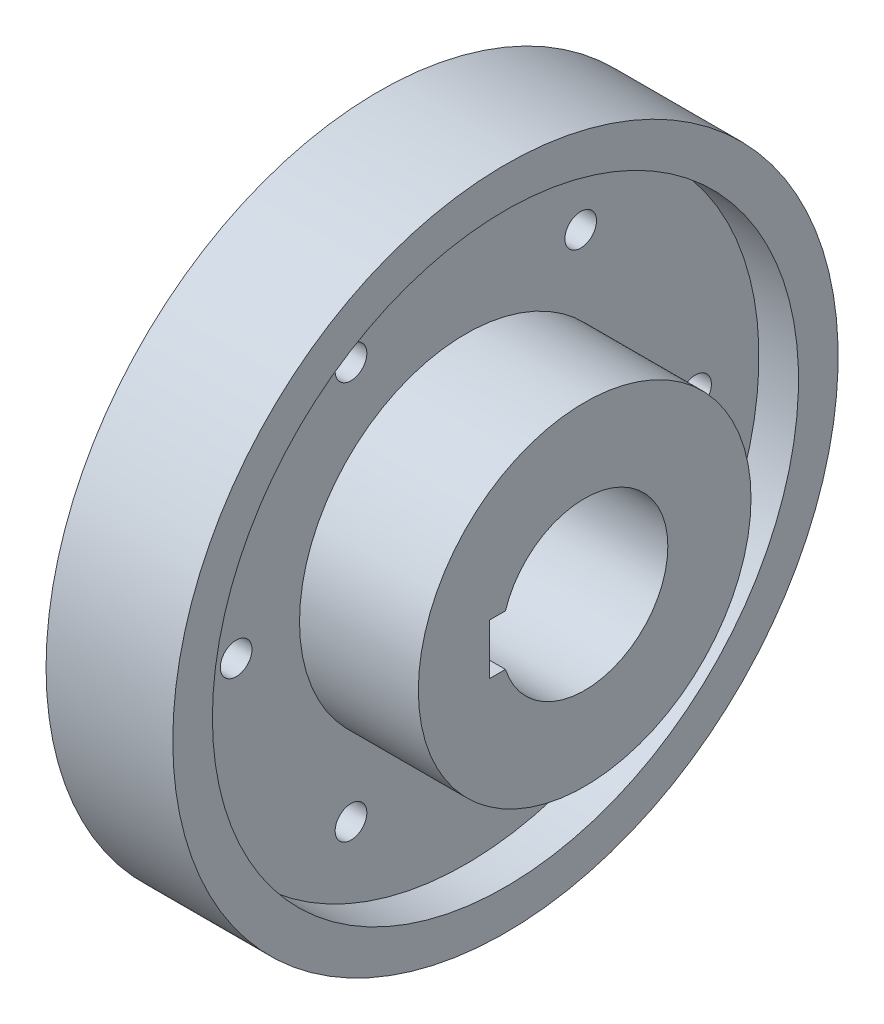
ISO-10303-21;
HEADER;
FILE_DESCRIPTION(('STEP AP214'),'2;1');
FILE_NAME('part.step','',(''),(''),'','','');
FILE_SCHEMA(('AUTOMOTIVE_DESIGN { 1 0 10303 214 1 1 1 1 }'));
ENDSEC;
DATA;
#1=APPLICATION_CONTEXT('core data for automotive mechanical design processes');
#2=APPLICATION_PROTOCOL_DEFINITION('international standard','automotive_design',2000,#1);
#3=PRODUCT_CONTEXT('',#1,'mechanical');
#4=PRODUCT('Part','Part','',(#3));
#5=PRODUCT_RELATED_PRODUCT_CATEGORY('part','',(#4));
#6=PRODUCT_DEFINITION_FORMATION('','',#4);
#7=PRODUCT_DEFINITION_CONTEXT('part definition',#1,'design');
#8=PRODUCT_DEFINITION('design','',#6,#7);
#9=PRODUCT_DEFINITION_SHAPE('','',#8);
#10=(LENGTH_UNIT() NAMED_UNIT(*) SI_UNIT(.MILLI.,.METRE.));
#11=(NAMED_UNIT(*) PLANE_ANGLE_UNIT() SI_UNIT($,.RADIAN.));
#12=(NAMED_UNIT(*) SI_UNIT($,.STERADIAN.) SOLID_ANGLE_UNIT());
#13=UNCERTAINTY_MEASURE_WITH_UNIT(LENGTH_MEASURE(1.E-05),#10,'distance_accuracy_value','');
#14=(GEOMETRIC_REPRESENTATION_CONTEXT(3) GLOBAL_UNCERTAINTY_ASSIGNED_CONTEXT((#13)) GLOBAL_UNIT_ASSIGNED_CONTEXT((#10,
#11,#12)) REPRESENTATION_CONTEXT('',''));
#15=CARTESIAN_POINT('',(0.,0.,0.));
#16=DIRECTION('',(0.,0.,1.));
#17=DIRECTION('',(1.,0.,0.));
#18=AXIS2_PLACEMENT_3D('',#15,#16,#17);
#19=CARTESIAN_POINT('',(0.,0.,0.));
#20=DIRECTION('',(-1.,0.,0.));
#21=DIRECTION('',(0.,0.,1.));
#22=AXIS2_PLACEMENT_3D('',#19,#20,#21);
#23=CYLINDRICAL_SURFACE('',#22,52.5);
#24=DIRECTION('',(-1.,0.,0.));
#25=VECTOR('',#24,1.);
#26=CARTESIAN_POINT('',(268.434782608695,16.,50.0024999375031));
#27=LINE('',#26,#25);
#28=CARTESIAN_POINT('',(268.434782608695,16.,50.0024999375031));
#29=VERTEX_POINT('',#28);
#30=CARTESIAN_POINT('',(148.434782608695,16.,50.0024999375031));
#31=VERTEX_POINT('',#30);
#32=EDGE_CURVE('E104',#29,#31,#27,.T.);
#33=ORIENTED_EDGE('',*,*,#32,.T.);
#34=CARTESIAN_POINT('',(148.434782608695,0.,0.));
#35=DIRECTION('',(-1.,0.,0.));
#36=DIRECTION('',(0.,0.,1.));
#37=AXIS2_PLACEMENT_3D('',#34,#35,#36);
#38=CIRCLE('',#37,52.5);
#39=CARTESIAN_POINT('',(148.434782608695,-16.,50.0024999375031));
#40=VERTEX_POINT('',#39);
#41=EDGE_CURVE('E96',#31,#40,#38,.T.);
#42=ORIENTED_EDGE('',*,*,#41,.T.);
#43=DIRECTION('',(-1.,0.,0.));
#44=VECTOR('',#43,1.);
#45=CARTESIAN_POINT('',(268.434782608695,-16.,50.0024999375031));
#46=LINE('',#45,#44);
#47=CARTESIAN_POINT('',(268.434782608695,-16.,50.0024999375031));
#48=VERTEX_POINT('',#47);
#49=EDGE_CURVE('E95',#48,#40,#46,.T.);
#50=ORIENTED_EDGE('',*,*,#49,.F.);
#51=CARTESIAN_POINT('',(268.434782608695,0.,0.));
#52=DIRECTION('',(-1.,0.,0.));
#53=DIRECTION('',(0.,0.,1.));
#54=AXIS2_PLACEMENT_3D('',#51,#52,#53);
#55=CIRCLE('',#54,52.4999999999999);
#56=EDGE_CURVE('E52',#29,#48,#55,.T.);
#57=ORIENTED_EDGE('',*,*,#56,.F.);
#58=EDGE_LOOP('',(#33,#42,#50,#57));
#59=FACE_BOUND('',#58,.T.);
#60=ADVANCED_FACE('F43',(#59),#23,.F.);
#61=CARTESIAN_POINT('',(268.434782608695,-16.,60.0024999375031));
#62=DIRECTION('',(0.,-1.,0.));
#63=DIRECTION('',(0.,0.,-1.));
#64=AXIS2_PLACEMENT_3D('',#61,#62,#63);
#65=PLANE('',#64);
#66=DIRECTION('',(0.,0.,-1.));
#67=VECTOR('',#66,1.);
#68=CARTESIAN_POINT('',(148.434782608695,-16.,60.0024999375031));
#69=LINE('',#68,#67);
#70=CARTESIAN_POINT('',(148.434782608695,-16.,60.0024999375031));
#71=VERTEX_POINT('',#70);
#72=EDGE_CURVE('E85',#71,#40,#69,.T.);
#73=ORIENTED_EDGE('',*,*,#72,.F.);
#74=DIRECTION('',(-1.,0.,0.));
#75=VECTOR('',#74,1.);
#76=CARTESIAN_POINT('',(268.434782608695,-16.,60.0024999375031));
#77=LINE('',#76,#75);
#78=CARTESIAN_POINT('',(268.434782608695,-16.,60.0024999375031));
#79=VERTEX_POINT('',#78);
#80=EDGE_CURVE('E92',#79,#71,#77,.T.);
#81=ORIENTED_EDGE('',*,*,#80,.F.);
#82=DIRECTION('',(0.,0.,1.));
#83=VECTOR('',#82,1.);
#84=CARTESIAN_POINT('',(268.434782608695,-16.,60.0024999375031));
#85=LINE('',#84,#83);
#86=EDGE_CURVE('E168',#48,#79,#85,.T.);
#87=ORIENTED_EDGE('',*,*,#86,.F.);
#88=ORIENTED_EDGE('',*,*,#49,.T.);
#89=EDGE_LOOP('',(#73,#81,#87,#88));
#90=FACE_BOUND('',#89,.T.);
#91=ADVANCED_FACE('F91',(#90),#65,.F.);
#92=CARTESIAN_POINT('',(268.434782608695,16.,60.0024999375031));
#93=DIRECTION('',(0.,1.,0.));
#94=DIRECTION('',(0.,0.,1.));
#95=AXIS2_PLACEMENT_3D('',#92,#93,#94);
#96=PLANE('',#95);
#97=DIRECTION('',(0.,0.,1.));
#98=VECTOR('',#97,1.);
#99=CARTESIAN_POINT('',(148.434782608695,16.,60.0024999375031));
#100=LINE('',#99,#98);
#101=CARTESIAN_POINT('',(148.434782608695,16.,60.0024999375031));
#102=VERTEX_POINT('',#101);
#103=EDGE_CURVE('E58',#31,#102,#100,.T.);
#104=ORIENTED_EDGE('',*,*,#103,.F.);
#105=ORIENTED_EDGE('',*,*,#32,.F.);
#106=DIRECTION('',(0.,0.,-1.));
#107=VECTOR('',#106,1.);
#108=CARTESIAN_POINT('',(268.434782608695,16.,60.0024999375031));
#109=LINE('',#108,#107);
#110=CARTESIAN_POINT('',(268.434782608695,16.,60.0024999375031));
#111=VERTEX_POINT('',#110);
#112=EDGE_CURVE('E66',#111,#29,#109,.T.);
#113=ORIENTED_EDGE('',*,*,#112,.F.);
#114=DIRECTION('',(-1.,0.,0.));
#115=VECTOR('',#114,1.);
#116=CARTESIAN_POINT('',(268.434782608695,16.,60.0024999375031));
#117=LINE('',#116,#115);
#118=EDGE_CURVE('E102',#111,#102,#117,.T.);
#119=ORIENTED_EDGE('',*,*,#118,.T.);
#120=EDGE_LOOP('',(#104,#105,#113,#119));
#121=FACE_BOUND('',#120,.T.);
#122=ADVANCED_FACE('F202',(#121),#96,.F.);
#123=CARTESIAN_POINT('',(268.434782608695,16.,60.0024999375031));
#124=DIRECTION('',(0.,0.,1.));
#125=DIRECTION('',(1.,0.,0.));
#126=AXIS2_PLACEMENT_3D('',#123,#124,#125);
#127=PLANE('',#126);
#128=DIRECTION('',(0.,-1.,0.));
#129=VECTOR('',#128,1.);
#130=CARTESIAN_POINT('',(148.434782608695,16.,60.0024999375031));
#131=LINE('',#130,#129);
#132=EDGE_CURVE('E11',#102,#71,#131,.T.);
#133=ORIENTED_EDGE('',*,*,#132,.F.);
#134=ORIENTED_EDGE('',*,*,#118,.F.);
#135=DIRECTION('',(0.,1.,0.));
#136=VECTOR('',#135,1.);
#137=CARTESIAN_POINT('',(268.434782608695,16.,60.0024999375031));
#138=LINE('',#137,#136);
#139=EDGE_CURVE('E100',#79,#111,#138,.T.);
#140=ORIENTED_EDGE('',*,*,#139,.F.);
#141=ORIENTED_EDGE('',*,*,#80,.T.);
#142=EDGE_LOOP('',(#133,#134,#140,#141));
#143=FACE_BOUND('',#142,.T.);
#144=ADVANCED_FACE('F98',(#143),#127,.F.);
#145=CARTESIAN_POINT('',(138.434782608695,0.,210.));
#146=DIRECTION('',(-1.,0.,0.));
#147=DIRECTION('',(0.,0.,1.));
#148=AXIS2_PLACEMENT_3D('',#145,#146,#147);
#149=PLANE('',#148);
#150=CARTESIAN_POINT('',(138.434782608695,0.,0.));
#151=DIRECTION('',(-1.,0.,0.));
#152=DIRECTION('',(0.,0.,1.));
#153=AXIS2_PLACEMENT_3D('',#150,#151,#152);
#154=CIRCLE('',#153,100.);
#155=CARTESIAN_POINT('',(138.434782608695,0.,-100.));
#156=VERTEX_POINT('',#155);
#157=EDGE_CURVE('E47',#156,#156,#154,.F.);
#158=ORIENTED_EDGE('',*,*,#157,.T.);
#159=EDGE_LOOP('',(#158));
#160=FACE_BOUND('',#159,.T.);
#161=CARTESIAN_POINT('',(138.434782608695,-125.573683548743,72.5000000000015));
#162=DIRECTION('',(1.,0.,0.));
#163=DIRECTION('',(0.,0.866025403784433,-0.50000000000001));
#164=AXIS2_PLACEMENT_3D('',#161,#162,#163);
#165=CIRCLE('',#164,10.);
#166=CARTESIAN_POINT('',(138.434782608695,-116.913429510898,67.5000000000014));
#167=VERTEX_POINT('',#166);
#168=EDGE_CURVE('E128',#167,#167,#165,.T.);
#169=ORIENTED_EDGE('',*,*,#168,.T.);
#170=EDGE_LOOP('',(#169));
#171=FACE_BOUND('',#170,.T.);
#172=CARTESIAN_POINT('',(138.434782608695,-125.573683548744,-72.4999999999988));
#173=DIRECTION('',(1.,0.,0.));
#174=DIRECTION('',(0.,0.866025403784443,0.499999999999992));
#175=AXIS2_PLACEMENT_3D('',#172,#173,#174);
#176=CIRCLE('',#175,10.);
#177=CARTESIAN_POINT('',(138.434782608695,-116.9134295109,-67.4999999999989));
#178=VERTEX_POINT('',#177);
#179=EDGE_CURVE('E122',#178,#178,#176,.T.);
#180=ORIENTED_EDGE('',*,*,#179,.T.);
#181=EDGE_LOOP('',(#180));
#182=FACE_BOUND('',#181,.T.);
#183=CARTESIAN_POINT('',(138.434782608695,0.,-145.));
#184=DIRECTION('',(1.,0.,0.));
#185=DIRECTION('',(0.,0.,1.));
#186=AXIS2_PLACEMENT_3D('',#183,#184,#185);
#187=CIRCLE('',#186,10.);
#188=CARTESIAN_POINT('',(138.434782608695,0.,-135.));
#189=VERTEX_POINT('',#188);
#190=EDGE_CURVE('E116',#189,#189,#187,.T.);
#191=ORIENTED_EDGE('',*,*,#190,.T.);
#192=EDGE_LOOP('',(#191));
#193=FACE_BOUND('',#192,.T.);
#194=CARTESIAN_POINT('',(138.434782608695,125.573683548743,-72.5000000000006));
#195=DIRECTION('',(1.,0.,0.));
#196=DIRECTION('',(0.,-0.866025403784436,0.500000000000004));
#197=AXIS2_PLACEMENT_3D('',#194,#195,#196);
#198=CIRCLE('',#197,10.);
#199=CARTESIAN_POINT('',(138.434782608695,116.913429510899,-67.5000000000005));
#200=VERTEX_POINT('',#199);
#201=EDGE_CURVE('E109',#200,#200,#198,.T.);
#202=ORIENTED_EDGE('',*,*,#201,.T.);
#203=EDGE_LOOP('',(#202));
#204=FACE_BOUND('',#203,.T.);
#205=CARTESIAN_POINT('',(138.434782608695,125.573683548744,72.4999999999997));
#206=DIRECTION('',(1.,0.,0.));
#207=DIRECTION('',(0.,-0.86602540378444,-0.499999999999998));
#208=AXIS2_PLACEMENT_3D('',#205,#206,#207);
#209=CIRCLE('',#208,10.);
#210=CARTESIAN_POINT('',(138.434782608695,116.913429510899,67.4999999999997));
#211=VERTEX_POINT('',#210);
#212=EDGE_CURVE('E134',#211,#211,#209,.T.);
#213=ORIENTED_EDGE('',*,*,#212,.T.);
#214=EDGE_LOOP('',(#213));
#215=FACE_BOUND('',#214,.T.);
#216=CARTESIAN_POINT('',(138.434782608695,0.,145.));
#217=DIRECTION('',(1.,0.,0.));
#218=DIRECTION('',(0.,0.,-1.));
#219=AXIS2_PLACEMENT_3D('',#216,#217,#218);
#220=CIRCLE('',#219,10.);
#221=CARTESIAN_POINT('',(138.434782608695,0.,135.));
#222=VERTEX_POINT('',#221);
#223=EDGE_CURVE('E140',#222,#222,#220,.T.);
#224=ORIENTED_EDGE('',*,*,#223,.T.);
#225=EDGE_LOOP('',(#224));
#226=FACE_BOUND('',#225,.T.);
#227=CARTESIAN_POINT('',(138.434782608695,0.,0.));
#228=DIRECTION('',(-1.,0.,0.));
#229=DIRECTION('',(0.,0.,1.));
#230=AXIS2_PLACEMENT_3D('',#227,#228,#229);
#231=CIRCLE('',#230,210.);
#232=CARTESIAN_POINT('',(138.434782608695,0.,210.));
#233=VERTEX_POINT('',#232);
#234=EDGE_CURVE('E143',#233,#233,#231,.T.);
#235=ORIENTED_EDGE('',*,*,#234,.T.);
#236=EDGE_LOOP('',(#235));
#237=FACE_BOUND('',#236,.T.);
#238=ADVANCED_FACE('F45',(#160,#171,#182,#193,#204,#215,#226,#237),#149,.T.);
#239=CARTESIAN_POINT('',(268.434782608695,0.,52.4999999999999));
#240=DIRECTION('',(1.,0.,0.));
#241=DIRECTION('',(0.,0.,-1.));
#242=AXIS2_PLACEMENT_3D('',#239,#240,#241);
#243=PLANE('',#242);
#244=ORIENTED_EDGE('',*,*,#86,.T.);
#245=ORIENTED_EDGE('',*,*,#139,.T.);
#246=ORIENTED_EDGE('',*,*,#112,.T.);
#247=ORIENTED_EDGE('',*,*,#56,.T.);
#248=EDGE_LOOP('',(#244,#245,#246,#247));
#249=FACE_BOUND('',#248,.T.);
#250=CARTESIAN_POINT('',(268.434782608695,0.,0.));
#251=DIRECTION('',(-1.,0.,0.));
#252=DIRECTION('',(0.,0.,1.));
#253=AXIS2_PLACEMENT_3D('',#250,#251,#252);
#254=CIRCLE('',#253,105.);
#255=CARTESIAN_POINT('',(268.434782608695,0.,105.));
#256=VERTEX_POINT('',#255);
#257=EDGE_CURVE('E160',#256,#256,#254,.T.);
#258=ORIENTED_EDGE('',*,*,#257,.F.);
#259=EDGE_LOOP('',(#258));
#260=FACE_BOUND('',#259,.T.);
#261=ADVANCED_FACE('F166',(#249,#260),#243,.T.);
#262=CARTESIAN_POINT('',(0.,0.,0.));
#263=DIRECTION('',(-1.,0.,0.));
#264=DIRECTION('',(0.,0.,1.));
#265=AXIS2_PLACEMENT_3D('',#262,#263,#264);
#266=CYLINDRICAL_SURFACE('',#265,105.);
#267=ORIENTED_EDGE('',*,*,#257,.T.);
#268=EDGE_LOOP('',(#267));
#269=FACE_BOUND('',#268,.T.);
#270=CARTESIAN_POINT('',(193.434782608695,0.,0.));
#271=DIRECTION('',(-1.,0.,0.));
#272=DIRECTION('',(0.,0.,1.));
#273=AXIS2_PLACEMENT_3D('',#270,#271,#272);
#274=CIRCLE('',#273,105.);
#275=CARTESIAN_POINT('',(193.434782608695,0.,105.));
#276=VERTEX_POINT('',#275);
#277=EDGE_CURVE('E157',#276,#276,#274,.T.);
#278=ORIENTED_EDGE('',*,*,#277,.F.);
#279=EDGE_LOOP('',(#278));
#280=FACE_BOUND('',#279,.T.);
#281=ADVANCED_FACE('F206',(#269,#280),#266,.T.);
#282=CARTESIAN_POINT('',(193.434782608695,0.,105.));
#283=DIRECTION('',(1.,0.,0.));
#284=DIRECTION('',(0.,0.,-1.));
#285=AXIS2_PLACEMENT_3D('',#282,#283,#284);
#286=PLANE('',#285);
#287=CARTESIAN_POINT('',(193.434782608695,-125.573683548743,72.5000000000015));
#288=DIRECTION('',(1.,0.,0.));
#289=DIRECTION('',(0.,0.866025403784433,-0.50000000000001));
#290=AXIS2_PLACEMENT_3D('',#287,#288,#289);
#291=CIRCLE('',#290,10.);
#292=CARTESIAN_POINT('',(193.434782608695,-116.913429510898,67.5000000000014));
#293=VERTEX_POINT('',#292);
#294=EDGE_CURVE('E131',#293,#293,#291,.T.);
#295=ORIENTED_EDGE('',*,*,#294,.F.);
#296=EDGE_LOOP('',(#295));
#297=FACE_BOUND('',#296,.T.);
#298=CARTESIAN_POINT('',(193.434782608695,-125.573683548744,-72.4999999999988));
#299=DIRECTION('',(1.,0.,0.));
#300=DIRECTION('',(0.,0.866025403784443,0.499999999999992));
#301=AXIS2_PLACEMENT_3D('',#298,#299,#300);
#302=CIRCLE('',#301,10.);
#303=CARTESIAN_POINT('',(193.434782608695,-116.9134295109,-67.4999999999989));
#304=VERTEX_POINT('',#303);
#305=EDGE_CURVE('E125',#304,#304,#302,.T.);
#306=ORIENTED_EDGE('',*,*,#305,.F.);
#307=EDGE_LOOP('',(#306));
#308=FACE_BOUND('',#307,.T.);
#309=CARTESIAN_POINT('',(193.434782608695,0.,-145.));
#310=DIRECTION('',(1.,0.,0.));
#311=DIRECTION('',(0.,0.,1.));
#312=AXIS2_PLACEMENT_3D('',#309,#310,#311);
#313=CIRCLE('',#312,10.);
#314=CARTESIAN_POINT('',(193.434782608695,0.,-135.));
#315=VERTEX_POINT('',#314);
#316=EDGE_CURVE('E119',#315,#315,#313,.T.);
#317=ORIENTED_EDGE('',*,*,#316,.F.);
#318=EDGE_LOOP('',(#317));
#319=FACE_BOUND('',#318,.T.);
#320=CARTESIAN_POINT('',(193.434782608695,125.573683548743,-72.5000000000006));
#321=DIRECTION('',(1.,0.,0.));
#322=DIRECTION('',(0.,-0.866025403784436,0.500000000000004));
#323=AXIS2_PLACEMENT_3D('',#320,#321,#322);
#324=CIRCLE('',#323,10.);
#325=CARTESIAN_POINT('',(193.434782608695,116.913429510899,-67.5000000000005));
#326=VERTEX_POINT('',#325);
#327=EDGE_CURVE('E113',#326,#326,#324,.T.);
#328=ORIENTED_EDGE('',*,*,#327,.F.);
#329=EDGE_LOOP('',(#328));
#330=FACE_BOUND('',#329,.T.);
#331=CARTESIAN_POINT('',(193.434782608695,125.573683548744,72.4999999999997));
#332=DIRECTION('',(1.,0.,0.));
#333=DIRECTION('',(0.,-0.86602540378444,-0.499999999999998));
#334=AXIS2_PLACEMENT_3D('',#331,#332,#333);
#335=CIRCLE('',#334,10.);
#336=CARTESIAN_POINT('',(193.434782608695,116.913429510899,67.4999999999997));
#337=VERTEX_POINT('',#336);
#338=EDGE_CURVE('E112',#337,#337,#335,.T.);
#339=ORIENTED_EDGE('',*,*,#338,.F.);
#340=EDGE_LOOP('',(#339));
#341=FACE_BOUND('',#340,.T.);
#342=CARTESIAN_POINT('',(193.434782608695,0.,145.));
#343=DIRECTION('',(1.,0.,0.));
#344=DIRECTION('',(0.,0.,-1.));
#345=AXIS2_PLACEMENT_3D('',#342,#343,#344);
#346=CIRCLE('',#345,10.);
#347=CARTESIAN_POINT('',(193.434782608695,0.,135.));
#348=VERTEX_POINT('',#347);
#349=EDGE_CURVE('E137',#348,#348,#346,.T.);
#350=ORIENTED_EDGE('',*,*,#349,.F.);
#351=EDGE_LOOP('',(#350));
#352=FACE_BOUND('',#351,.T.);
#353=ORIENTED_EDGE('',*,*,#277,.T.);
#354=EDGE_LOOP('',(#353));
#355=FACE_BOUND('',#354,.T.);
#356=CARTESIAN_POINT('',(193.434782608695,0.,0.));
#357=DIRECTION('',(-1.,0.,0.));
#358=DIRECTION('',(0.,0.,1.));
#359=AXIS2_PLACEMENT_3D('',#356,#357,#358);
#360=CIRCLE('',#359,185.);
#361=CARTESIAN_POINT('',(193.434782608695,0.,185.));
#362=VERTEX_POINT('',#361);
#363=EDGE_CURVE('E154',#362,#362,#360,.T.);
#364=ORIENTED_EDGE('',*,*,#363,.F.);
#365=EDGE_LOOP('',(#364));
#366=FACE_BOUND('',#365,.T.);
#367=ADVANCED_FACE('F209',(#297,#308,#319,#330,#341,#352,#355,#366),#286,.T.);
#368=CARTESIAN_POINT('',(0.,0.,0.));
#369=DIRECTION('',(-1.,0.,0.));
#370=DIRECTION('',(0.,0.,1.));
#371=AXIS2_PLACEMENT_3D('',#368,#369,#370);
#372=CYLINDRICAL_SURFACE('',#371,185.);
#373=ORIENTED_EDGE('',*,*,#363,.T.);
#374=EDGE_LOOP('',(#373));
#375=FACE_BOUND('',#374,.T.);
#376=CARTESIAN_POINT('',(218.434782608695,0.,0.));
#377=DIRECTION('',(-1.,0.,0.));
#378=DIRECTION('',(0.,0.,1.));
#379=AXIS2_PLACEMENT_3D('',#376,#377,#378);
#380=CIRCLE('',#379,185.);
#381=CARTESIAN_POINT('',(218.434782608695,0.,185.));
#382=VERTEX_POINT('',#381);
#383=EDGE_CURVE('E151',#382,#382,#380,.T.);
#384=ORIENTED_EDGE('',*,*,#383,.F.);
#385=EDGE_LOOP('',(#384));
#386=FACE_BOUND('',#385,.T.);
#387=ADVANCED_FACE('F213',(#375,#386),#372,.F.);
#388=CARTESIAN_POINT('',(218.434782608695,0.,185.));
#389=DIRECTION('',(1.,0.,0.));
#390=DIRECTION('',(0.,0.,-1.));
#391=AXIS2_PLACEMENT_3D('',#388,#389,#390);
#392=PLANE('',#391);
#393=ORIENTED_EDGE('',*,*,#383,.T.);
#394=EDGE_LOOP('',(#393));
#395=FACE_BOUND('',#394,.T.);
#396=CARTESIAN_POINT('',(218.434782608695,0.,0.));
#397=DIRECTION('',(-1.,0.,0.));
#398=DIRECTION('',(0.,0.,1.));
#399=AXIS2_PLACEMENT_3D('',#396,#397,#398);
#400=CIRCLE('',#399,210.);
#401=CARTESIAN_POINT('',(218.434782608695,0.,210.));
#402=VERTEX_POINT('',#401);
#403=EDGE_CURVE('E148',#402,#402,#400,.T.);
#404=ORIENTED_EDGE('',*,*,#403,.F.);
#405=EDGE_LOOP('',(#404));
#406=FACE_BOUND('',#405,.T.);
#407=ADVANCED_FACE('F217',(#395,#406),#392,.T.);
#408=CARTESIAN_POINT('',(0.,0.,0.));
#409=DIRECTION('',(-1.,0.,0.));
#410=DIRECTION('',(0.,0.,1.));
#411=AXIS2_PLACEMENT_3D('',#408,#409,#410);
#412=CYLINDRICAL_SURFACE('',#411,210.);
#413=ORIENTED_EDGE('',*,*,#403,.T.);
#414=EDGE_LOOP('',(#413));
#415=FACE_BOUND('',#414,.T.);
#416=ORIENTED_EDGE('',*,*,#234,.F.);
#417=EDGE_LOOP('',(#416));
#418=FACE_BOUND('',#417,.T.);
#419=ADVANCED_FACE('F221',(#415,#418),#412,.T.);
#420=CARTESIAN_POINT('',(138.434782608695,0.,145.));
#421=DIRECTION('',(1.,0.,0.));
#422=DIRECTION('',(0.,0.,-1.));
#423=AXIS2_PLACEMENT_3D('',#420,#421,#422);
#424=CYLINDRICAL_SURFACE('',#423,10.);
#425=ORIENTED_EDGE('',*,*,#223,.F.);
#426=EDGE_LOOP('',(#425));
#427=FACE_BOUND('',#426,.T.);
#428=ORIENTED_EDGE('',*,*,#349,.T.);
#429=EDGE_LOOP('',(#428));
#430=FACE_BOUND('',#429,.T.);
#431=ADVANCED_FACE('F225',(#427,#430),#424,.F.);
#432=CARTESIAN_POINT('',(138.434782608695,125.573683548744,72.4999999999997));
#433=DIRECTION('',(1.,0.,0.));
#434=DIRECTION('',(0.,0.,-1.));
#435=AXIS2_PLACEMENT_3D('',#432,#433,#434);
#436=CYLINDRICAL_SURFACE('',#435,10.);
#437=ORIENTED_EDGE('',*,*,#212,.F.);
#438=EDGE_LOOP('',(#437));
#439=FACE_BOUND('',#438,.T.);
#440=ORIENTED_EDGE('',*,*,#338,.T.);
#441=EDGE_LOOP('',(#440));
#442=FACE_BOUND('',#441,.T.);
#443=ADVANCED_FACE('F229',(#439,#442),#436,.F.);
#444=CARTESIAN_POINT('',(138.434782608695,125.573683548743,-72.5000000000006));
#445=DIRECTION('',(1.,0.,0.));
#446=DIRECTION('',(0.,0.,-1.));
#447=AXIS2_PLACEMENT_3D('',#444,#445,#446);
#448=CYLINDRICAL_SURFACE('',#447,10.);
#449=ORIENTED_EDGE('',*,*,#201,.F.);
#450=EDGE_LOOP('',(#449));
#451=FACE_BOUND('',#450,.T.);
#452=ORIENTED_EDGE('',*,*,#327,.T.);
#453=EDGE_LOOP('',(#452));
#454=FACE_BOUND('',#453,.T.);
#455=ADVANCED_FACE('F232',(#451,#454),#448,.F.);
#456=CARTESIAN_POINT('',(138.434782608695,0.,-145.));
#457=DIRECTION('',(1.,0.,0.));
#458=DIRECTION('',(0.,0.,-1.));
#459=AXIS2_PLACEMENT_3D('',#456,#457,#458);
#460=CYLINDRICAL_SURFACE('',#459,10.);
#461=ORIENTED_EDGE('',*,*,#190,.F.);
#462=EDGE_LOOP('',(#461));
#463=FACE_BOUND('',#462,.T.);
#464=ORIENTED_EDGE('',*,*,#316,.T.);
#465=EDGE_LOOP('',(#464));
#466=FACE_BOUND('',#465,.T.);
#467=ADVANCED_FACE('F237',(#463,#466),#460,.F.);
#468=CARTESIAN_POINT('',(138.434782608695,-125.573683548744,-72.4999999999988));
#469=DIRECTION('',(1.,0.,0.));
#470=DIRECTION('',(0.,0.,-1.));
#471=AXIS2_PLACEMENT_3D('',#468,#469,#470);
#472=CYLINDRICAL_SURFACE('',#471,10.);
#473=ORIENTED_EDGE('',*,*,#179,.F.);
#474=EDGE_LOOP('',(#473));
#475=FACE_BOUND('',#474,.T.);
#476=ORIENTED_EDGE('',*,*,#305,.T.);
#477=EDGE_LOOP('',(#476));
#478=FACE_BOUND('',#477,.T.);
#479=ADVANCED_FACE('F192',(#475,#478),#472,.F.);
#480=CARTESIAN_POINT('',(138.434782608695,-125.573683548743,72.5000000000015));
#481=DIRECTION('',(1.,0.,0.));
#482=DIRECTION('',(0.,0.,-1.));
#483=AXIS2_PLACEMENT_3D('',#480,#481,#482);
#484=CYLINDRICAL_SURFACE('',#483,10.);
#485=ORIENTED_EDGE('',*,*,#168,.F.);
#486=EDGE_LOOP('',(#485));
#487=FACE_BOUND('',#486,.T.);
#488=ORIENTED_EDGE('',*,*,#294,.T.);
#489=EDGE_LOOP('',(#488));
#490=FACE_BOUND('',#489,.T.);
#491=ADVANCED_FACE('F183',(#487,#490),#484,.F.);
#492=CARTESIAN_POINT('',(138.434770608695,0.,0.));
#493=DIRECTION('',(1.,0.,0.));
#494=DIRECTION('',(0.,0.,-1.));
#495=AXIS2_PLACEMENT_3D('',#492,#493,#494);
#496=CYLINDRICAL_SURFACE('',#495,100.);
#497=CARTESIAN_POINT('',(148.434782608695,0.,0.));
#498=DIRECTION('',(-1.,0.,0.));
#499=DIRECTION('',(0.,0.,1.));
#500=AXIS2_PLACEMENT_3D('',#497,#498,#499);
#501=CIRCLE('',#500,100.);
#502=CARTESIAN_POINT('',(148.434782608695,0.,-100.));
#503=VERTEX_POINT('',#502);
#504=EDGE_CURVE('E177',#503,#503,#501,.T.);
#505=CARTESIAN_POINT('',(138.434782608695,0.,-100.));
#506=CARTESIAN_POINT('',(138.538949275362,0.,-100.));
#507=CARTESIAN_POINT('',(138.643115942029,0.,-100.));
#508=CARTESIAN_POINT('',(138.851449275362,0.,-100.));
#509=CARTESIAN_POINT('',(138.955615942029,0.,-100.));
#510=CARTESIAN_POINT('',(139.163949275362,0.,-100.));
#511=CARTESIAN_POINT('',(139.268115942029,0.,-100.));
#512=CARTESIAN_POINT('',(139.476449275362,0.,-100.));
#513=CARTESIAN_POINT('',(139.580615942029,0.,-100.));
#514=CARTESIAN_POINT('',(139.788949275362,0.,-100.));
#515=CARTESIAN_POINT('',(139.893115942029,0.,-100.));
#516=CARTESIAN_POINT('',(140.101449275362,0.,-100.));
#517=CARTESIAN_POINT('',(140.205615942029,0.,-100.));
#518=CARTESIAN_POINT('',(140.413949275362,0.,-100.));
#519=CARTESIAN_POINT('',(140.518115942029,0.,-100.));
#520=CARTESIAN_POINT('',(140.726449275362,0.,-100.));
#521=CARTESIAN_POINT('',(140.830615942029,0.,-100.));
#522=CARTESIAN_POINT('',(141.038949275362,0.,-100.));
#523=CARTESIAN_POINT('',(141.143115942029,0.,-100.));
#524=CARTESIAN_POINT('',(141.351449275362,0.,-100.));
#525=CARTESIAN_POINT('',(141.455615942029,0.,-100.));
#526=CARTESIAN_POINT('',(141.663949275362,0.,-100.));
#527=CARTESIAN_POINT('',(141.768115942029,0.,-100.));
#528=CARTESIAN_POINT('',(141.976449275362,0.,-100.));
#529=CARTESIAN_POINT('',(142.080615942029,0.,-100.));
#530=CARTESIAN_POINT('',(142.288949275362,0.,-100.));
#531=CARTESIAN_POINT('',(142.393115942029,0.,-100.));
#532=CARTESIAN_POINT('',(142.601449275362,0.,-100.));
#533=CARTESIAN_POINT('',(142.705615942029,0.,-100.));
#534=CARTESIAN_POINT('',(142.913949275362,0.,-100.));
#535=CARTESIAN_POINT('',(143.018115942029,0.,-100.));
#536=CARTESIAN_POINT('',(143.226449275362,0.,-100.));
#537=CARTESIAN_POINT('',(143.330615942029,0.,-100.));
#538=CARTESIAN_POINT('',(143.538949275362,0.,-100.));
#539=CARTESIAN_POINT('',(143.643115942029,0.,-100.));
#540=CARTESIAN_POINT('',(143.851449275362,0.,-100.));
#541=CARTESIAN_POINT('',(143.955615942029,0.,-100.));
#542=CARTESIAN_POINT('',(144.163949275362,0.,-100.));
#543=CARTESIAN_POINT('',(144.268115942029,0.,-100.));
#544=CARTESIAN_POINT('',(144.476449275362,0.,-100.));
#545=CARTESIAN_POINT('',(144.580615942029,0.,-100.));
#546=CARTESIAN_POINT('',(144.788949275362,0.,-100.));
#547=CARTESIAN_POINT('',(144.893115942029,0.,-100.));
#548=CARTESIAN_POINT('',(145.101449275362,0.,-100.));
#549=CARTESIAN_POINT('',(145.205615942029,0.,-100.));
#550=CARTESIAN_POINT('',(145.413949275362,0.,-100.));
#551=CARTESIAN_POINT('',(145.518115942029,0.,-100.));
#552=CARTESIAN_POINT('',(145.726449275362,0.,-100.));
#553=CARTESIAN_POINT('',(145.830615942029,0.,-100.));
#554=CARTESIAN_POINT('',(146.038949275362,0.,-100.));
#555=CARTESIAN_POINT('',(146.143115942029,0.,-100.));
#556=CARTESIAN_POINT('',(146.351449275362,0.,-100.));
#557=CARTESIAN_POINT('',(146.455615942029,0.,-100.));
#558=CARTESIAN_POINT('',(146.663949275362,0.,-100.));
#559=CARTESIAN_POINT('',(146.768115942029,0.,-100.));
#560=CARTESIAN_POINT('',(146.976449275362,0.,-100.));
#561=CARTESIAN_POINT('',(147.080615942029,0.,-100.));
#562=CARTESIAN_POINT('',(147.288949275362,0.,-100.));
#563=CARTESIAN_POINT('',(147.393115942029,0.,-100.));
#564=CARTESIAN_POINT('',(147.601449275362,0.,-100.));
#565=CARTESIAN_POINT('',(147.705615942029,0.,-100.));
#566=CARTESIAN_POINT('',(147.913949275362,0.,-100.));
#567=CARTESIAN_POINT('',(148.018115942029,0.,-100.));
#568=CARTESIAN_POINT('',(148.226449275362,0.,-100.));
#569=CARTESIAN_POINT('',(148.330615942029,0.,-100.));
#570=CARTESIAN_POINT('',(148.434782608695,0.,-100.));
#571=B_SPLINE_CURVE_WITH_KNOTS('',3,(#505,#506,#507,#508,#509,#510,#511,#512,#513,#514,#515,
#516,#517,#518,#519,#520,#521,#522,#523,#524,#525,#526,#527,#528,#529,#530,#531,#532,#533,#534,
#535,#536,#537,#538,#539,#540,#541,#542,#543,#544,#545,#546,#547,#548,#549,#550,#551,#552,#553,
#554,#555,#556,#557,#558,#559,#560,#561,#562,#563,#564,#565,#566,#567,#568,#569,#570),
.UNSPECIFIED.,.F.,.F.,(4,2,2,2,2,2,2,2,2,2,2,2,2,2,2,2,2,2,2,2,2,2,2,2,2,2,2,2,2,2,2,2,4),(0.,
0.312499999999993,0.624999999999987,0.93749999999998,1.25,1.56249999999999,1.87499999999999,
2.18749999999998,2.5,2.8125,3.12499999999999,3.43749999999998,3.75,4.0625,4.37499999999999,
4.68749999999998,5.,5.3125,5.62499999999999,5.93749999999998,6.25000000000001,6.5625,
6.87499999999999,7.18749999999999,7.50000000000001,7.8125,8.12499999999999,8.43749999999999,
8.75000000000001,9.0625,9.37499999999999,9.68749999999999,10.),.UNSPECIFIED.);
#572=EDGE_CURVE('BSEAM181',#156,#503,#571,.T.);
#573=ORIENTED_EDGE('',*,*,#157,.F.);
#574=ORIENTED_EDGE('',*,*,#504,.F.);
#575=ORIENTED_EDGE('',*,*,#572,.T.);
#576=ORIENTED_EDGE('',*,*,#572,.F.);
#577=EDGE_LOOP('',(#573,#575,#574,#576));
#578=FACE_BOUND('',#577,.T.);
#579=ADVANCED_FACE('F181',(#578),#496,.F.);
#580=CARTESIAN_POINT('',(148.434782608695,0.,0.));
#581=DIRECTION('',(-1.,0.,0.));
#582=DIRECTION('',(0.,0.,1.));
#583=AXIS2_PLACEMENT_3D('',#580,#581,#582);
#584=PLANE('',#583);
#585=ORIENTED_EDGE('',*,*,#103,.T.);
#586=ORIENTED_EDGE('',*,*,#132,.T.);
#587=ORIENTED_EDGE('',*,*,#72,.T.);
#588=ORIENTED_EDGE('',*,*,#41,.F.);
#589=EDGE_LOOP('',(#585,#586,#587,#588));
#590=FACE_BOUND('',#589,.T.);
#591=ORIENTED_EDGE('',*,*,#504,.T.);
#592=EDGE_LOOP('',(#591));
#593=FACE_BOUND('',#592,.T.);
#594=ADVANCED_FACE('F83',(#590,#593),#584,.T.);
#595=CLOSED_SHELL('',(#60,#91,#122,#144,#238,#261,#281,#367,#387,#407,#419,#431,#443,#455,#467,
#479,#491,#579,#594));
#596=MANIFOLD_SOLID_BREP('B2',#595);
#597=ADVANCED_BREP_SHAPE_REPRESENTATION('',(#18,#596),#14);
#598=SHAPE_DEFINITION_REPRESENTATION(#9,#597);
ENDSEC;
END-ISO-10303-21;
